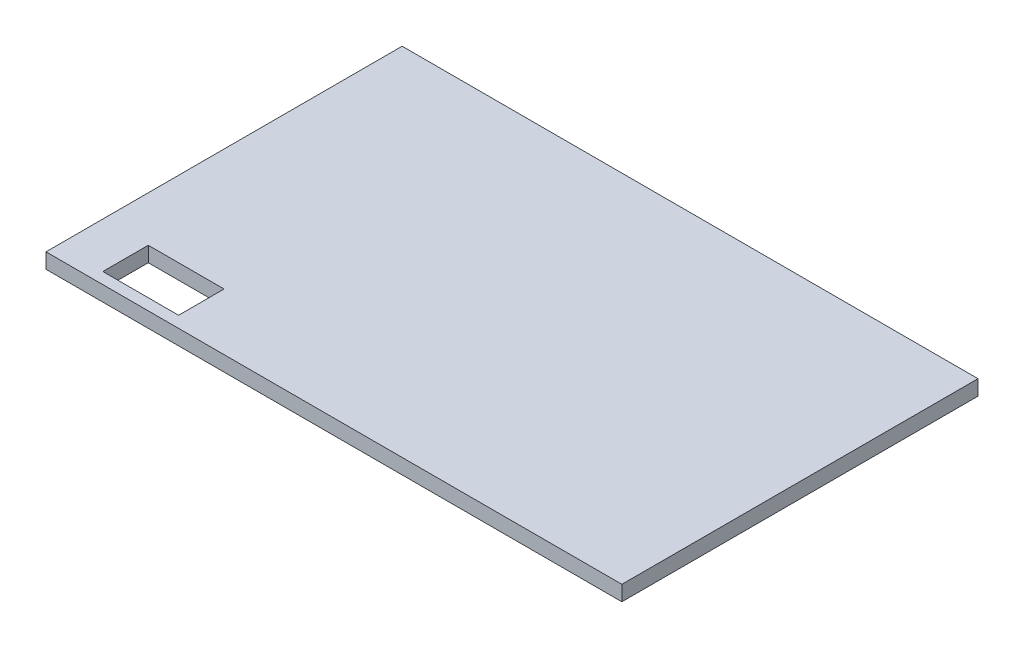
ISO-10303-21;
HEADER;
FILE_DESCRIPTION(('STEP AP214'),'2;1');
FILE_NAME('part.step','',(''),(''),'','','');
FILE_SCHEMA(('AUTOMOTIVE_DESIGN { 1 0 10303 214 1 1 1 1 }'));
ENDSEC;
DATA;
#1=APPLICATION_CONTEXT('core data for automotive mechanical design processes');
#2=APPLICATION_PROTOCOL_DEFINITION('international standard','automotive_design',2000,#1);
#3=PRODUCT_CONTEXT('',#1,'mechanical');
#4=PRODUCT('Part','Part','',(#3));
#5=PRODUCT_RELATED_PRODUCT_CATEGORY('part','',(#4));
#6=PRODUCT_DEFINITION_FORMATION('','',#4);
#7=PRODUCT_DEFINITION_CONTEXT('part definition',#1,'design');
#8=PRODUCT_DEFINITION('design','',#6,#7);
#9=PRODUCT_DEFINITION_SHAPE('','',#8);
#10=(LENGTH_UNIT() NAMED_UNIT(*) SI_UNIT(.MILLI.,.METRE.));
#11=(NAMED_UNIT(*) PLANE_ANGLE_UNIT() SI_UNIT($,.RADIAN.));
#12=(NAMED_UNIT(*) SI_UNIT($,.STERADIAN.) SOLID_ANGLE_UNIT());
#13=UNCERTAINTY_MEASURE_WITH_UNIT(LENGTH_MEASURE(1.E-05),#10,'distance_accuracy_value','');
#14=(GEOMETRIC_REPRESENTATION_CONTEXT(3) GLOBAL_UNCERTAINTY_ASSIGNED_CONTEXT((#13)) GLOBAL_UNIT_ASSIGNED_CONTEXT((#10,
#11,#12)) REPRESENTATION_CONTEXT('',''));
#15=CARTESIAN_POINT('',(0.,0.,0.));
#16=DIRECTION('',(0.,0.,1.));
#17=DIRECTION('',(1.,0.,0.));
#18=AXIS2_PLACEMENT_3D('',#15,#16,#17);
#19=CARTESIAN_POINT('',(3.,10.,-1.));
#20=DIRECTION('',(0.,0.,-1.));
#21=DIRECTION('',(-1.,0.,0.));
#22=AXIS2_PLACEMENT_3D('',#19,#20,#21);
#23=PLANE('',#22);
#24=DIRECTION('',(0.,1.,0.));
#25=VECTOR('',#24,1.);
#26=CARTESIAN_POINT('',(3.,0.,-1.));
#27=LINE('',#26,#25);
#28=CARTESIAN_POINT('',(3.,0.,-1.));
#29=VERTEX_POINT('',#28);
#30=CARTESIAN_POINT('',(3.,1.,-1.));
#31=VERTEX_POINT('',#30);
#32=EDGE_CURVE('E133',#29,#31,#27,.T.);
#33=ORIENTED_EDGE('',*,*,#32,.T.);
#34=DIRECTION('',(1.,0.,0.));
#35=VECTOR('',#34,1.);
#36=CARTESIAN_POINT('',(3.,1.,-1.));
#37=LINE('',#36,#35);
#38=CARTESIAN_POINT('',(8.,1.,-1.));
#39=VERTEX_POINT('',#38);
#40=EDGE_CURVE('E186',#31,#39,#37,.T.);
#41=ORIENTED_EDGE('',*,*,#40,.T.);
#42=DIRECTION('',(0.,1.,0.));
#43=VECTOR('',#42,1.);
#44=CARTESIAN_POINT('',(8.,0.,-1.));
#45=LINE('',#44,#43);
#46=CARTESIAN_POINT('',(8.,0.,-1.));
#47=VERTEX_POINT('',#46);
#48=EDGE_CURVE('E151',#47,#39,#45,.T.);
#49=ORIENTED_EDGE('',*,*,#48,.F.);
#50=DIRECTION('',(1.,0.,0.));
#51=VECTOR('',#50,1.);
#52=CARTESIAN_POINT('',(4.,0.,-1.));
#53=LINE('',#52,#51);
#54=EDGE_CURVE('E132',#29,#47,#53,.T.);
#55=ORIENTED_EDGE('',*,*,#54,.F.);
#56=EDGE_LOOP('',(#33,#41,#49,#55));
#57=FACE_BOUND('',#56,.T.);
#58=ADVANCED_FACE('F46',(#57),#23,.T.);
#59=CARTESIAN_POINT('',(0.,2.,0.));
#60=DIRECTION('',(1.,0.,0.));
#61=DIRECTION('',(0.,0.,-1.));
#62=AXIS2_PLACEMENT_3D('',#59,#60,#61);
#63=PLANE('',#62);
#64=DIRECTION('',(0.,0.,1.));
#65=VECTOR('',#64,1.);
#66=CARTESIAN_POINT('',(0.,1.,-24.));
#67=LINE('',#66,#65);
#68=CARTESIAN_POINT('',(0.,1.,-23.75));
#69=VERTEX_POINT('',#68);
#70=CARTESIAN_POINT('',(0.,1.,-0.25));
#71=VERTEX_POINT('',#70);
#72=EDGE_CURVE('E177',#69,#71,#67,.T.);
#73=ORIENTED_EDGE('',*,*,#72,.F.);
#74=DIRECTION('',(0.,1.,0.));
#75=VECTOR('',#74,1.);
#76=CARTESIAN_POINT('',(0.,0.,-23.75));
#77=LINE('',#76,#75);
#78=CARTESIAN_POINT('',(0.,0.,-23.75));
#79=VERTEX_POINT('',#78);
#80=EDGE_CURVE('E62',#79,#69,#77,.T.);
#81=ORIENTED_EDGE('',*,*,#80,.F.);
#82=DIRECTION('',(0.,0.,1.));
#83=VECTOR('',#82,1.);
#84=CARTESIAN_POINT('',(0.,0.,0.));
#85=LINE('',#84,#83);
#86=CARTESIAN_POINT('',(0.,0.,-0.25));
#87=VERTEX_POINT('',#86);
#88=EDGE_CURVE('E55',#79,#87,#85,.T.);
#89=ORIENTED_EDGE('',*,*,#88,.T.);
#90=DIRECTION('',(0.,-1.,0.));
#91=VECTOR('',#90,1.);
#92=CARTESIAN_POINT('',(0.,0.,-0.25));
#93=LINE('',#92,#91);
#94=EDGE_CURVE('E163',#71,#87,#93,.T.);
#95=ORIENTED_EDGE('',*,*,#94,.F.);
#96=EDGE_LOOP('',(#73,#81,#89,#95));
#97=FACE_BOUND('',#96,.T.);
#98=ADVANCED_FACE('F48',(#97),#63,.F.);
#99=CARTESIAN_POINT('',(4.,0.,-4.));
#100=DIRECTION('',(0.,0.,-1.));
#101=DIRECTION('',(-1.,0.,0.));
#102=AXIS2_PLACEMENT_3D('',#99,#100,#101);
#103=PLANE('',#102);
#104=DIRECTION('',(1.,0.,0.));
#105=VECTOR('',#104,1.);
#106=CARTESIAN_POINT('',(4.,1.,-4.));
#107=LINE('',#106,#105);
#108=CARTESIAN_POINT('',(3.,1.,-4.));
#109=VERTEX_POINT('',#108);
#110=CARTESIAN_POINT('',(8.,1.,-4.));
#111=VERTEX_POINT('',#110);
#112=EDGE_CURVE('E183',#109,#111,#107,.T.);
#113=ORIENTED_EDGE('',*,*,#112,.F.);
#114=DIRECTION('',(0.,1.,0.));
#115=VECTOR('',#114,1.);
#116=CARTESIAN_POINT('',(3.,0.,-4.));
#117=LINE('',#116,#115);
#118=CARTESIAN_POINT('',(3.,0.,-4.));
#119=VERTEX_POINT('',#118);
#120=EDGE_CURVE('E141',#119,#109,#117,.T.);
#121=ORIENTED_EDGE('',*,*,#120,.F.);
#122=DIRECTION('',(-1.,0.,0.));
#123=VECTOR('',#122,1.);
#124=CARTESIAN_POINT('',(4.,0.,-4.));
#125=LINE('',#124,#123);
#126=CARTESIAN_POINT('',(8.,0.,-4.));
#127=VERTEX_POINT('',#126);
#128=EDGE_CURVE('E148',#127,#119,#125,.T.);
#129=ORIENTED_EDGE('',*,*,#128,.F.);
#130=DIRECTION('',(0.,1.,0.));
#131=VECTOR('',#130,1.);
#132=CARTESIAN_POINT('',(8.,0.,-4.));
#133=LINE('',#132,#131);
#134=EDGE_CURVE('E152',#127,#111,#133,.T.);
#135=ORIENTED_EDGE('',*,*,#134,.T.);
#136=EDGE_LOOP('',(#113,#121,#129,#135));
#137=FACE_BOUND('',#136,.T.);
#138=ADVANCED_FACE('F207',(#137),#103,.F.);
#139=CARTESIAN_POINT('',(8.,0.,-1.));
#140=DIRECTION('',(1.,0.,0.));
#141=DIRECTION('',(0.,0.,-1.));
#142=AXIS2_PLACEMENT_3D('',#139,#140,#141);
#143=PLANE('',#142);
#144=DIRECTION('',(0.,0.,1.));
#145=VECTOR('',#144,1.);
#146=CARTESIAN_POINT('',(8.,1.,-1.));
#147=LINE('',#146,#145);
#148=EDGE_CURVE('E190',#111,#39,#147,.T.);
#149=ORIENTED_EDGE('',*,*,#148,.F.);
#150=ORIENTED_EDGE('',*,*,#134,.F.);
#151=DIRECTION('',(0.,0.,-1.));
#152=VECTOR('',#151,1.);
#153=CARTESIAN_POINT('',(8.,0.,-1.));
#154=LINE('',#153,#152);
#155=EDGE_CURVE('E138',#47,#127,#154,.T.);
#156=ORIENTED_EDGE('',*,*,#155,.F.);
#157=ORIENTED_EDGE('',*,*,#48,.T.);
#158=EDGE_LOOP('',(#149,#150,#156,#157));
#159=FACE_BOUND('',#158,.T.);
#160=ADVANCED_FACE('F212',(#159),#143,.F.);
#161=CARTESIAN_POINT('',(38.,0.,0.));
#162=DIRECTION('',(1.,0.,0.));
#163=DIRECTION('',(0.,0.,-1.));
#164=AXIS2_PLACEMENT_3D('',#161,#162,#163);
#165=PLANE('',#164);
#166=DIRECTION('',(0.,-1.,0.));
#167=VECTOR('',#166,1.);
#168=CARTESIAN_POINT('',(38.,0.,-23.75));
#169=LINE('',#168,#167);
#170=CARTESIAN_POINT('',(38.,1.,-23.75));
#171=VERTEX_POINT('',#170);
#172=CARTESIAN_POINT('',(38.,0.,-23.75));
#173=VERTEX_POINT('',#172);
#174=EDGE_CURVE('E110',#171,#173,#169,.T.);
#175=ORIENTED_EDGE('',*,*,#174,.F.);
#176=DIRECTION('',(0.,0.,-1.));
#177=VECTOR('',#176,1.);
#178=CARTESIAN_POINT('',(38.,1.,-24.));
#179=LINE('',#178,#177);
#180=CARTESIAN_POINT('',(38.,1.,-0.25));
#181=VERTEX_POINT('',#180);
#182=EDGE_CURVE('E180',#181,#171,#179,.T.);
#183=ORIENTED_EDGE('',*,*,#182,.F.);
#184=DIRECTION('',(0.,1.,0.));
#185=VECTOR('',#184,1.);
#186=CARTESIAN_POINT('',(38.,0.,-0.25));
#187=LINE('',#186,#185);
#188=CARTESIAN_POINT('',(38.,0.,-0.25));
#189=VERTEX_POINT('',#188);
#190=EDGE_CURVE('E70',#189,#181,#187,.T.);
#191=ORIENTED_EDGE('',*,*,#190,.F.);
#192=DIRECTION('',(0.,0.,-1.));
#193=VECTOR('',#192,1.);
#194=CARTESIAN_POINT('',(38.,0.,0.));
#195=LINE('',#194,#193);
#196=EDGE_CURVE('E127',#189,#173,#195,.T.);
#197=ORIENTED_EDGE('',*,*,#196,.T.);
#198=EDGE_LOOP('',(#175,#183,#191,#197));
#199=FACE_BOUND('',#198,.T.);
#200=ADVANCED_FACE('F130',(#199),#165,.T.);
#201=CARTESIAN_POINT('',(3.,0.,-4.));
#202=DIRECTION('',(-1.,0.,0.));
#203=DIRECTION('',(0.,0.,1.));
#204=AXIS2_PLACEMENT_3D('',#201,#202,#203);
#205=PLANE('',#204);
#206=DIRECTION('',(0.,0.,-1.));
#207=VECTOR('',#206,1.);
#208=CARTESIAN_POINT('',(3.,1.,-4.));
#209=LINE('',#208,#207);
#210=EDGE_CURVE('E11',#31,#109,#209,.T.);
#211=ORIENTED_EDGE('',*,*,#210,.F.);
#212=ORIENTED_EDGE('',*,*,#32,.F.);
#213=DIRECTION('',(0.,0.,1.));
#214=VECTOR('',#213,1.);
#215=CARTESIAN_POINT('',(3.,0.,-4.));
#216=LINE('',#215,#214);
#217=EDGE_CURVE('E193',#119,#29,#216,.T.);
#218=ORIENTED_EDGE('',*,*,#217,.F.);
#219=ORIENTED_EDGE('',*,*,#120,.T.);
#220=EDGE_LOOP('',(#211,#212,#218,#219));
#221=FACE_BOUND('',#220,.T.);
#222=ADVANCED_FACE('F202',(#221),#205,.F.);
#223=CARTESIAN_POINT('',(0.,0.,0.));
#224=DIRECTION('',(0.,-1.,0.));
#225=DIRECTION('',(0.,0.,-1.));
#226=AXIS2_PLACEMENT_3D('',#223,#224,#225);
#227=PLANE('',#226);
#228=DIRECTION('',(-1.,0.,0.));
#229=VECTOR('',#228,1.);
#230=CARTESIAN_POINT('',(38.,0.,-23.75));
#231=LINE('',#230,#229);
#232=EDGE_CURVE('E113',#173,#79,#231,.T.);
#233=ORIENTED_EDGE('',*,*,#232,.F.);
#234=ORIENTED_EDGE('',*,*,#196,.F.);
#235=DIRECTION('',(1.,0.,0.));
#236=VECTOR('',#235,1.);
#237=CARTESIAN_POINT('',(0.,0.,-0.25));
#238=LINE('',#237,#236);
#239=EDGE_CURVE('E165',#87,#189,#238,.T.);
#240=ORIENTED_EDGE('',*,*,#239,.F.);
#241=ORIENTED_EDGE('',*,*,#88,.F.);
#242=EDGE_LOOP('',(#233,#234,#240,#241));
#243=FACE_BOUND('',#242,.T.);
#244=ORIENTED_EDGE('',*,*,#217,.T.);
#245=ORIENTED_EDGE('',*,*,#54,.T.);
#246=ORIENTED_EDGE('',*,*,#155,.T.);
#247=ORIENTED_EDGE('',*,*,#128,.T.);
#248=EDGE_LOOP('',(#244,#245,#246,#247));
#249=FACE_BOUND('',#248,.T.);
#250=ADVANCED_FACE('F124',(#243,#249),#227,.T.);
#251=CARTESIAN_POINT('',(0.,1.,0.));
#252=DIRECTION('',(0.,1.,0.));
#253=DIRECTION('',(0.,0.,1.));
#254=AXIS2_PLACEMENT_3D('',#251,#252,#253);
#255=PLANE('',#254);
#256=DIRECTION('',(1.,0.,0.));
#257=VECTOR('',#256,1.);
#258=CARTESIAN_POINT('',(38.,1.,-23.75));
#259=LINE('',#258,#257);
#260=EDGE_CURVE('E114',#69,#171,#259,.T.);
#261=ORIENTED_EDGE('',*,*,#260,.F.);
#262=ORIENTED_EDGE('',*,*,#72,.T.);
#263=DIRECTION('',(-1.,0.,0.));
#264=VECTOR('',#263,1.);
#265=CARTESIAN_POINT('',(0.,1.,-0.25));
#266=LINE('',#265,#264);
#267=EDGE_CURVE('E166',#181,#71,#266,.T.);
#268=ORIENTED_EDGE('',*,*,#267,.F.);
#269=ORIENTED_EDGE('',*,*,#182,.T.);
#270=EDGE_LOOP('',(#261,#262,#268,#269));
#271=FACE_BOUND('',#270,.T.);
#272=ORIENTED_EDGE('',*,*,#148,.T.);
#273=ORIENTED_EDGE('',*,*,#40,.F.);
#274=ORIENTED_EDGE('',*,*,#210,.T.);
#275=ORIENTED_EDGE('',*,*,#112,.T.);
#276=EDGE_LOOP('',(#272,#273,#274,#275));
#277=FACE_BOUND('',#276,.T.);
#278=ADVANCED_FACE('F210',(#271,#277),#255,.T.);
#279=CARTESIAN_POINT('',(0.,0.,-0.25));
#280=DIRECTION('',(0.,0.,-1.));
#281=DIRECTION('',(-1.,0.,0.));
#282=AXIS2_PLACEMENT_3D('',#279,#280,#281);
#283=PLANE('',#282);
#284=ORIENTED_EDGE('',*,*,#94,.T.);
#285=ORIENTED_EDGE('',*,*,#239,.T.);
#286=ORIENTED_EDGE('',*,*,#190,.T.);
#287=ORIENTED_EDGE('',*,*,#267,.T.);
#288=EDGE_LOOP('',(#284,#285,#286,#287));
#289=FACE_BOUND('',#288,.T.);
#290=ADVANCED_FACE('F164',(#289),#283,.F.);
#291=CARTESIAN_POINT('',(0.,0.,-23.75));
#292=DIRECTION('',(0.,0.,1.));
#293=DIRECTION('',(1.,0.,0.));
#294=AXIS2_PLACEMENT_3D('',#291,#292,#293);
#295=PLANE('',#294);
#296=ORIENTED_EDGE('',*,*,#174,.T.);
#297=ORIENTED_EDGE('',*,*,#232,.T.);
#298=ORIENTED_EDGE('',*,*,#80,.T.);
#299=ORIENTED_EDGE('',*,*,#260,.T.);
#300=EDGE_LOOP('',(#296,#297,#298,#299));
#301=FACE_BOUND('',#300,.T.);
#302=ADVANCED_FACE('F112',(#301),#295,.F.);
#303=CLOSED_SHELL('',(#58,#98,#138,#160,#200,#222,#250,#278,#290,#302));
#304=MANIFOLD_SOLID_BREP('B2',#303);
#305=ADVANCED_BREP_SHAPE_REPRESENTATION('',(#18,#304),#14);
#306=SHAPE_DEFINITION_REPRESENTATION(#9,#305);
ENDSEC;
END-ISO-10303-21;
